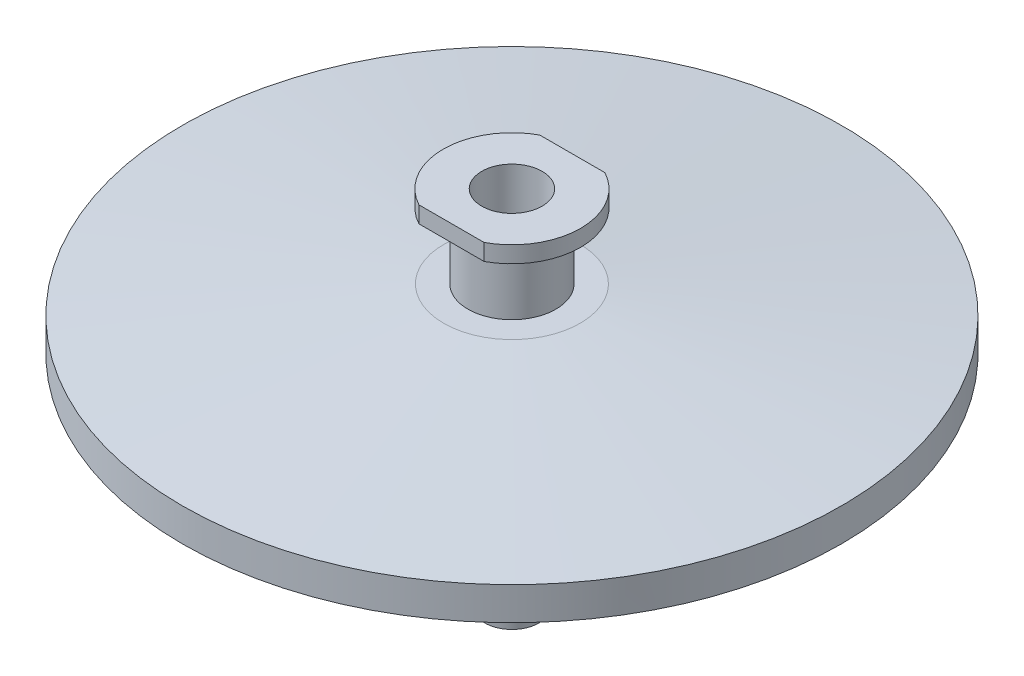
ISO-10303-21;
HEADER;
FILE_DESCRIPTION(('STEP AP214'),'2;1');
FILE_NAME('part.step','',(''),(''),'','','');
FILE_SCHEMA(('AUTOMOTIVE_DESIGN { 1 0 10303 214 1 1 1 1 }'));
ENDSEC;
DATA;
#1=APPLICATION_CONTEXT('core data for automotive mechanical design processes');
#2=APPLICATION_PROTOCOL_DEFINITION('international standard','automotive_design',2000,#1);
#3=PRODUCT_CONTEXT('',#1,'mechanical');
#4=PRODUCT('Part','Part','',(#3));
#5=PRODUCT_RELATED_PRODUCT_CATEGORY('part','',(#4));
#6=PRODUCT_DEFINITION_FORMATION('','',#4);
#7=PRODUCT_DEFINITION_CONTEXT('part definition',#1,'design');
#8=PRODUCT_DEFINITION('design','',#6,#7);
#9=PRODUCT_DEFINITION_SHAPE('','',#8);
#10=(LENGTH_UNIT() NAMED_UNIT(*) SI_UNIT(.MILLI.,.METRE.));
#11=(NAMED_UNIT(*) PLANE_ANGLE_UNIT() SI_UNIT($,.RADIAN.));
#12=(NAMED_UNIT(*) SI_UNIT($,.STERADIAN.) SOLID_ANGLE_UNIT());
#13=UNCERTAINTY_MEASURE_WITH_UNIT(LENGTH_MEASURE(1.E-05),#10,'distance_accuracy_value','');
#14=(GEOMETRIC_REPRESENTATION_CONTEXT(3) GLOBAL_UNCERTAINTY_ASSIGNED_CONTEXT((#13)) GLOBAL_UNIT_ASSIGNED_CONTEXT((#10,
#11,#12)) REPRESENTATION_CONTEXT('',''));
#15=CARTESIAN_POINT('',(0.,0.,0.));
#16=DIRECTION('',(0.,0.,1.));
#17=DIRECTION('',(1.,0.,0.));
#18=AXIS2_PLACEMENT_3D('',#15,#16,#17);
#19=CARTESIAN_POINT('',(0.,-0.127,0.));
#20=DIRECTION('',(0.,1.,0.));
#21=DIRECTION('',(0.,0.,1.));
#22=AXIS2_PLACEMENT_3D('',#19,#20,#21);
#23=CYLINDRICAL_SURFACE('',#22,13.97);
#24=CARTESIAN_POINT('',(0.,-0.127,0.));
#25=DIRECTION('',(0.,1.,0.));
#26=DIRECTION('',(0.,0.,1.));
#27=AXIS2_PLACEMENT_3D('',#24,#25,#26);
#28=CIRCLE('',#27,13.97);
#29=CARTESIAN_POINT('',(0.,-0.127,13.97));
#30=VERTEX_POINT('',#29);
#31=EDGE_CURVE('E11',#30,#30,#28,.T.);
#32=ORIENTED_EDGE('',*,*,#31,.T.);
#33=EDGE_LOOP('',(#32));
#34=FACE_BOUND('',#33,.T.);
#35=CARTESIAN_POINT('',(0.,0.127,0.));
#36=DIRECTION('',(0.,1.,0.));
#37=DIRECTION('',(0.,0.,1.));
#38=AXIS2_PLACEMENT_3D('',#35,#36,#37);
#39=CIRCLE('',#38,13.97);
#40=CARTESIAN_POINT('',(0.,0.127,13.97));
#41=VERTEX_POINT('',#40);
#42=EDGE_CURVE('E57',#41,#41,#39,.T.);
#43=ORIENTED_EDGE('',*,*,#42,.F.);
#44=EDGE_LOOP('',(#43));
#45=FACE_BOUND('',#44,.T.);
#46=ADVANCED_FACE('F51',(#34,#45),#23,.T.);
#47=CARTESIAN_POINT('',(0.,-0.127,0.));
#48=DIRECTION('',(0.,1.,0.));
#49=DIRECTION('',(0.,0.,1.));
#50=AXIS2_PLACEMENT_3D('',#47,#48,#49);
#51=PLANE('',#50);
#52=ORIENTED_EDGE('',*,*,#31,.F.);
#53=EDGE_LOOP('',(#52));
#54=FACE_BOUND('',#53,.T.);
#55=ADVANCED_FACE('F66',(#54),#51,.F.);
#56=CARTESIAN_POINT('',(0.,0.127,0.));
#57=DIRECTION('',(0.,1.,0.));
#58=DIRECTION('',(0.,0.,1.));
#59=AXIS2_PLACEMENT_3D('',#56,#57,#58);
#60=PLANE('',#59);
#61=ORIENTED_EDGE('',*,*,#42,.T.);
#62=EDGE_LOOP('',(#61));
#63=FACE_BOUND('',#62,.T.);
#64=ADVANCED_FACE('F63',(#63),#60,.T.);
#65=CLOSED_SHELL('',(#46,#55,#64));
#66=MANIFOLD_SOLID_BREP('B2',#65);
#67=CARTESIAN_POINT('',(0.,5.08,0.));
#68=DIRECTION('',(0.,1.,0.));
#69=DIRECTION('',(0.,0.,1.));
#70=AXIS2_PLACEMENT_3D('',#67,#68,#69);
#71=CYLINDRICAL_SURFACE('',#70,3.175);
#72=DIRECTION('',(0.,1.,0.));
#73=VECTOR('',#72,1.);
#74=CARTESIAN_POINT('',(-1.50804144505382,5.08,2.794));
#75=LINE('',#74,#73);
#76=CARTESIAN_POINT('',(-1.50804144505382,5.842,2.794));
#77=VERTEX_POINT('',#76);
#78=CARTESIAN_POINT('',(-1.50804144505382,5.08,2.794));
#79=VERTEX_POINT('',#78);
#80=EDGE_CURVE('E166',#77,#79,#75,.F.);
#81=ORIENTED_EDGE('',*,*,#80,.F.);
#82=CARTESIAN_POINT('',(0.,5.842,0.));
#83=DIRECTION('',(0.,1.,0.));
#84=DIRECTION('',(0.,0.,1.));
#85=AXIS2_PLACEMENT_3D('',#82,#83,#84);
#86=CIRCLE('',#85,3.175);
#87=CARTESIAN_POINT('',(-1.50804144505382,5.842,-2.794));
#88=VERTEX_POINT('',#87);
#89=EDGE_CURVE('E151',#88,#77,#86,.T.);
#90=ORIENTED_EDGE('',*,*,#89,.F.);
#91=DIRECTION('',(0.,1.,0.));
#92=VECTOR('',#91,1.);
#93=CARTESIAN_POINT('',(-1.50804144505382,5.08,-2.794));
#94=LINE('',#93,#92);
#95=CARTESIAN_POINT('',(-1.50804144505382,5.08,-2.794));
#96=VERTEX_POINT('',#95);
#97=EDGE_CURVE('E109',#96,#88,#94,.T.);
#98=ORIENTED_EDGE('',*,*,#97,.F.);
#99=CARTESIAN_POINT('',(0.,5.08,0.));
#100=DIRECTION('',(0.,1.,0.));
#101=DIRECTION('',(0.,0.,1.));
#102=AXIS2_PLACEMENT_3D('',#99,#100,#101);
#103=CIRCLE('',#102,3.175);
#104=EDGE_CURVE('E149',#96,#79,#103,.T.);
#105=ORIENTED_EDGE('',*,*,#104,.T.);
#106=EDGE_LOOP('',(#81,#90,#98,#105));
#107=FACE_BOUND('',#106,.T.);
#108=ADVANCED_FACE('F92',(#107),#71,.T.);
#109=CARTESIAN_POINT('',(0.,5.842,0.));
#110=DIRECTION('',(0.,-1.,0.));
#111=DIRECTION('',(0.,0.,-1.));
#112=AXIS2_PLACEMENT_3D('',#109,#110,#111);
#113=CYLINDRICAL_SURFACE('',#112,2.032);
#114=CARTESIAN_POINT('',(0.,2.032,0.));
#115=DIRECTION('',(0.,1.,0.));
#116=DIRECTION('',(0.,0.,1.));
#117=AXIS2_PLACEMENT_3D('',#114,#115,#116);
#118=CIRCLE('',#117,2.032);
#119=CARTESIAN_POINT('',(0.,2.032,-2.032));
#120=VERTEX_POINT('',#119);
#121=EDGE_CURVE('E173',#120,#120,#118,.T.);
#122=CARTESIAN_POINT('',(0.,5.08,0.));
#123=DIRECTION('',(0.,1.,0.));
#124=DIRECTION('',(0.,0.,1.));
#125=AXIS2_PLACEMENT_3D('',#122,#123,#124);
#126=CIRCLE('',#125,2.032);
#127=CARTESIAN_POINT('',(0.,5.08,-2.032));
#128=VERTEX_POINT('',#127);
#129=EDGE_CURVE('E197',#128,#128,#126,.T.);
#130=CARTESIAN_POINT('',(0.,2.032,-2.032));
#131=CARTESIAN_POINT('',(0.,2.06375,-2.032));
#132=CARTESIAN_POINT('',(0.,2.0955,-2.032));
#133=CARTESIAN_POINT('',(0.,2.159,-2.032));
#134=CARTESIAN_POINT('',(0.,2.19075,-2.032));
#135=CARTESIAN_POINT('',(0.,2.25425,-2.032));
#136=CARTESIAN_POINT('',(0.,2.286,-2.032));
#137=CARTESIAN_POINT('',(0.,2.3495,-2.032));
#138=CARTESIAN_POINT('',(0.,2.38125,-2.032));
#139=CARTESIAN_POINT('',(0.,2.44475,-2.032));
#140=CARTESIAN_POINT('',(0.,2.4765,-2.032));
#141=CARTESIAN_POINT('',(0.,2.54,-2.032));
#142=CARTESIAN_POINT('',(0.,2.57175,-2.032));
#143=CARTESIAN_POINT('',(0.,2.63525,-2.032));
#144=CARTESIAN_POINT('',(0.,2.667,-2.032));
#145=CARTESIAN_POINT('',(0.,2.7305,-2.032));
#146=CARTESIAN_POINT('',(0.,2.76225,-2.032));
#147=CARTESIAN_POINT('',(0.,2.82575,-2.032));
#148=CARTESIAN_POINT('',(0.,2.8575,-2.032));
#149=CARTESIAN_POINT('',(0.,2.921,-2.032));
#150=CARTESIAN_POINT('',(0.,2.95275,-2.032));
#151=CARTESIAN_POINT('',(0.,3.01625,-2.032));
#152=CARTESIAN_POINT('',(0.,3.048,-2.032));
#153=CARTESIAN_POINT('',(0.,3.1115,-2.032));
#154=CARTESIAN_POINT('',(0.,3.14325,-2.032));
#155=CARTESIAN_POINT('',(0.,3.20675,-2.032));
#156=CARTESIAN_POINT('',(0.,3.2385,-2.032));
#157=CARTESIAN_POINT('',(0.,3.302,-2.032));
#158=CARTESIAN_POINT('',(0.,3.33375,-2.032));
#159=CARTESIAN_POINT('',(0.,3.39725,-2.032));
#160=CARTESIAN_POINT('',(0.,3.429,-2.032));
#161=CARTESIAN_POINT('',(0.,3.4925,-2.032));
#162=CARTESIAN_POINT('',(0.,3.52425,-2.032));
#163=CARTESIAN_POINT('',(0.,3.58775,-2.032));
#164=CARTESIAN_POINT('',(0.,3.6195,-2.032));
#165=CARTESIAN_POINT('',(0.,3.683,-2.032));
#166=CARTESIAN_POINT('',(0.,3.71475,-2.032));
#167=CARTESIAN_POINT('',(0.,3.77825,-2.032));
#168=CARTESIAN_POINT('',(0.,3.81,-2.032));
#169=CARTESIAN_POINT('',(0.,3.8735,-2.032));
#170=CARTESIAN_POINT('',(0.,3.90525,-2.032));
#171=CARTESIAN_POINT('',(0.,3.96875,-2.032));
#172=CARTESIAN_POINT('',(0.,4.0005,-2.032));
#173=CARTESIAN_POINT('',(0.,4.064,-2.032));
#174=CARTESIAN_POINT('',(0.,4.09575,-2.032));
#175=CARTESIAN_POINT('',(0.,4.15925,-2.032));
#176=CARTESIAN_POINT('',(0.,4.191,-2.032));
#177=CARTESIAN_POINT('',(0.,4.2545,-2.032));
#178=CARTESIAN_POINT('',(0.,4.28625,-2.032));
#179=CARTESIAN_POINT('',(0.,4.34975,-2.032));
#180=CARTESIAN_POINT('',(0.,4.3815,-2.032));
#181=CARTESIAN_POINT('',(0.,4.445,-2.032));
#182=CARTESIAN_POINT('',(0.,4.47675,-2.032));
#183=CARTESIAN_POINT('',(0.,4.54025,-2.032));
#184=CARTESIAN_POINT('',(0.,4.572,-2.032));
#185=CARTESIAN_POINT('',(0.,4.6355,-2.032));
#186=CARTESIAN_POINT('',(0.,4.66725,-2.032));
#187=CARTESIAN_POINT('',(0.,4.73075,-2.032));
#188=CARTESIAN_POINT('',(0.,4.7625,-2.032));
#189=CARTESIAN_POINT('',(0.,4.826,-2.032));
#190=CARTESIAN_POINT('',(0.,4.85775,-2.032));
#191=CARTESIAN_POINT('',(0.,4.92125,-2.032));
#192=CARTESIAN_POINT('',(0.,4.953,-2.032));
#193=CARTESIAN_POINT('',(0.,5.0165,-2.032));
#194=CARTESIAN_POINT('',(0.,5.04825,-2.032));
#195=CARTESIAN_POINT('',(0.,5.08,-2.032));
#196=B_SPLINE_CURVE_WITH_KNOTS('',3,(#130,#131,#132,#133,#134,#135,#136,#137,#138,#139,#140,
#141,#142,#143,#144,#145,#146,#147,#148,#149,#150,#151,#152,#153,#154,#155,#156,#157,#158,#159,
#160,#161,#162,#163,#164,#165,#166,#167,#168,#169,#170,#171,#172,#173,#174,#175,#176,#177,#178,
#179,#180,#181,#182,#183,#184,#185,#186,#187,#188,#189,#190,#191,#192,#193,#194,#195),
.UNSPECIFIED.,.F.,.F.,(4,2,2,2,2,2,2,2,2,2,2,2,2,2,2,2,2,2,2,2,2,2,2,2,2,2,2,2,2,2,2,2,4),(0.,
0.0952499999999998,0.1905,0.28575,0.381,0.47625,0.5715,0.66675,0.762,0.85725,0.9525,1.04775,
1.143,1.23825,1.3335,1.42875,1.524,1.61925,1.7145,1.80975,1.905,2.00025,2.0955,2.19075,2.286,
2.38125,2.4765,2.57175,2.667,2.76225,2.8575,2.95275,3.048),.UNSPECIFIED.);
#197=EDGE_CURVE('BSEAM245',#120,#128,#196,.T.);
#198=ORIENTED_EDGE('',*,*,#121,.T.);
#199=ORIENTED_EDGE('',*,*,#129,.F.);
#200=ORIENTED_EDGE('',*,*,#197,.T.);
#201=ORIENTED_EDGE('',*,*,#197,.F.);
#202=EDGE_LOOP('',(#198,#200,#199,#201));
#203=FACE_BOUND('',#202,.T.);
#204=ADVANCED_FACE('F245',(#203),#113,.T.);
#205=CARTESIAN_POINT('',(0.,-0.762,0.));
#206=DIRECTION('',(0.,1.,0.));
#207=DIRECTION('',(0.,0.,1.));
#208=AXIS2_PLACEMENT_3D('',#205,#206,#207);
#209=CYLINDRICAL_SURFACE('',#208,15.24);
#210=CARTESIAN_POINT('',(0.,-0.762,0.));
#211=DIRECTION('',(0.,-1.,0.));
#212=DIRECTION('',(0.,0.,-1.));
#213=AXIS2_PLACEMENT_3D('',#210,#211,#212);
#214=CIRCLE('',#213,15.24);
#215=CARTESIAN_POINT('',(0.,-0.762,15.24));
#216=VERTEX_POINT('',#215);
#217=EDGE_CURVE('E177',#216,#216,#214,.T.);
#218=CARTESIAN_POINT('',(0.,0.762,0.));
#219=DIRECTION('',(0.,1.,0.));
#220=DIRECTION('',(0.,0.,1.));
#221=AXIS2_PLACEMENT_3D('',#218,#219,#220);
#222=CIRCLE('',#221,15.24);
#223=CARTESIAN_POINT('',(0.,0.762,15.24));
#224=VERTEX_POINT('',#223);
#225=EDGE_CURVE('E189',#224,#224,#222,.T.);
#226=CARTESIAN_POINT('',(0.,-0.762,15.24));
#227=CARTESIAN_POINT('',(0.,-0.746125,15.24));
#228=CARTESIAN_POINT('',(0.,-0.73025,15.24));
#229=CARTESIAN_POINT('',(0.,-0.6985,15.24));
#230=CARTESIAN_POINT('',(0.,-0.682625,15.24));
#231=CARTESIAN_POINT('',(0.,-0.650875,15.24));
#232=CARTESIAN_POINT('',(0.,-0.635,15.24));
#233=CARTESIAN_POINT('',(0.,-0.60325,15.24));
#234=CARTESIAN_POINT('',(0.,-0.587375,15.24));
#235=CARTESIAN_POINT('',(0.,-0.555625,15.24));
#236=CARTESIAN_POINT('',(0.,-0.53975,15.24));
#237=CARTESIAN_POINT('',(0.,-0.508,15.24));
#238=CARTESIAN_POINT('',(0.,-0.492125,15.24));
#239=CARTESIAN_POINT('',(0.,-0.460375,15.24));
#240=CARTESIAN_POINT('',(0.,-0.4445,15.24));
#241=CARTESIAN_POINT('',(0.,-0.41275,15.24));
#242=CARTESIAN_POINT('',(0.,-0.396875,15.24));
#243=CARTESIAN_POINT('',(0.,-0.365125,15.24));
#244=CARTESIAN_POINT('',(0.,-0.34925,15.24));
#245=CARTESIAN_POINT('',(0.,-0.3175,15.24));
#246=CARTESIAN_POINT('',(0.,-0.301625,15.24));
#247=CARTESIAN_POINT('',(0.,-0.269875,15.24));
#248=CARTESIAN_POINT('',(0.,-0.254,15.24));
#249=CARTESIAN_POINT('',(0.,-0.22225,15.24));
#250=CARTESIAN_POINT('',(0.,-0.206375,15.24));
#251=CARTESIAN_POINT('',(0.,-0.174625,15.24));
#252=CARTESIAN_POINT('',(0.,-0.15875,15.24));
#253=CARTESIAN_POINT('',(0.,-0.127,15.24));
#254=CARTESIAN_POINT('',(0.,-0.111125,15.24));
#255=CARTESIAN_POINT('',(0.,-0.0793750000000001,15.24));
#256=CARTESIAN_POINT('',(0.,-0.0635,15.24));
#257=CARTESIAN_POINT('',(0.,-0.03175,15.24));
#258=CARTESIAN_POINT('',(0.,-0.015875,15.24));
#259=CARTESIAN_POINT('',(0.,0.015875,15.24));
#260=CARTESIAN_POINT('',(0.,0.03175,15.24));
#261=CARTESIAN_POINT('',(0.,0.0635,15.24));
#262=CARTESIAN_POINT('',(0.,0.0793750000000001,15.24));
#263=CARTESIAN_POINT('',(0.,0.111125,15.24));
#264=CARTESIAN_POINT('',(0.,0.127,15.24));
#265=CARTESIAN_POINT('',(0.,0.15875,15.24));
#266=CARTESIAN_POINT('',(0.,0.174625,15.24));
#267=CARTESIAN_POINT('',(0.,0.206375,15.24));
#268=CARTESIAN_POINT('',(0.,0.22225,15.24));
#269=CARTESIAN_POINT('',(0.,0.254,15.24));
#270=CARTESIAN_POINT('',(0.,0.269875,15.24));
#271=CARTESIAN_POINT('',(0.,0.301625,15.24));
#272=CARTESIAN_POINT('',(0.,0.3175,15.24));
#273=CARTESIAN_POINT('',(0.,0.34925,15.24));
#274=CARTESIAN_POINT('',(0.,0.365125,15.24));
#275=CARTESIAN_POINT('',(0.,0.396875,15.24));
#276=CARTESIAN_POINT('',(0.,0.41275,15.24));
#277=CARTESIAN_POINT('',(0.,0.4445,15.24));
#278=CARTESIAN_POINT('',(0.,0.460375,15.24));
#279=CARTESIAN_POINT('',(0.,0.492125,15.24));
#280=CARTESIAN_POINT('',(0.,0.508,15.24));
#281=CARTESIAN_POINT('',(0.,0.53975,15.24));
#282=CARTESIAN_POINT('',(0.,0.555625,15.24));
#283=CARTESIAN_POINT('',(0.,0.587375,15.24));
#284=CARTESIAN_POINT('',(0.,0.60325,15.24));
#285=CARTESIAN_POINT('',(0.,0.635,15.24));
#286=CARTESIAN_POINT('',(0.,0.650875,15.24));
#287=CARTESIAN_POINT('',(0.,0.682625,15.24));
#288=CARTESIAN_POINT('',(0.,0.6985,15.24));
#289=CARTESIAN_POINT('',(0.,0.73025,15.24));
#290=CARTESIAN_POINT('',(0.,0.746125,15.24));
#291=CARTESIAN_POINT('',(0.,0.762,15.24));
#292=B_SPLINE_CURVE_WITH_KNOTS('',3,(#226,#227,#228,#229,#230,#231,#232,#233,#234,#235,#236,
#237,#238,#239,#240,#241,#242,#243,#244,#245,#246,#247,#248,#249,#250,#251,#252,#253,#254,#255,
#256,#257,#258,#259,#260,#261,#262,#263,#264,#265,#266,#267,#268,#269,#270,#271,#272,#273,#274,
#275,#276,#277,#278,#279,#280,#281,#282,#283,#284,#285,#286,#287,#288,#289,#290,#291),
.UNSPECIFIED.,.F.,.F.,(4,2,2,2,2,2,2,2,2,2,2,2,2,2,2,2,2,2,2,2,2,2,2,2,2,2,2,2,2,2,2,2,4),(0.,
0.047625,0.0952500000000001,0.142875,0.1905,0.238125,0.28575,0.333375,0.381,0.428625,0.47625,
0.523875,0.5715,0.619125,0.66675,0.714375,0.762,0.809625,0.85725,0.904875,0.9525,1.000125,
1.04775,1.095375,1.143,1.190625,1.23825,1.285875,1.3335,1.381125,1.42875,1.476375,1.524),.UNSPECIFIED.);
#293=EDGE_CURVE('BSEAM94',#216,#224,#292,.T.);
#294=ORIENTED_EDGE('',*,*,#217,.F.);
#295=ORIENTED_EDGE('',*,*,#225,.F.);
#296=ORIENTED_EDGE('',*,*,#293,.T.);
#297=ORIENTED_EDGE('',*,*,#293,.F.);
#298=EDGE_LOOP('',(#294,#296,#295,#297));
#299=FACE_BOUND('',#298,.T.);
#300=ADVANCED_FACE('F94',(#299),#209,.T.);
#301=CARTESIAN_POINT('',(0.,0.762,0.));
#302=DIRECTION('',(0.,-1.,0.));
#303=DIRECTION('',(0.,0.,1.));
#304=AXIS2_PLACEMENT_3D('',#301,#302,#303);
#305=CONICAL_SURFACE('',#304,15.24,1.46607657167524);
#306=CARTESIAN_POINT('',(0.,2.032,0.));
#307=DIRECTION('',(0.,1.,0.));
#308=DIRECTION('',(0.,0.,1.));
#309=AXIS2_PLACEMENT_3D('',#306,#307,#308);
#310=CIRCLE('',#309,3.15675714313695);
#311=CARTESIAN_POINT('',(0.,2.032,3.15675714313695));
#312=VERTEX_POINT('',#311);
#313=EDGE_CURVE('E185',#312,#312,#310,.T.);
#314=CARTESIAN_POINT('',(0.,2.032,3.15675714313695));
#315=CARTESIAN_POINT('',(0.,2.01877083333333,3.28262425622928));
#316=CARTESIAN_POINT('',(0.,2.00554166666667,3.4084913693216));
#317=CARTESIAN_POINT('',(0.,1.97908333333333,3.66022559550625));
#318=CARTESIAN_POINT('',(0.,1.96585416666667,3.78609270859857));
#319=CARTESIAN_POINT('',(0.,1.93939583333333,4.03782693478322));
#320=CARTESIAN_POINT('',(0.,1.92616666666667,4.16369404787554));
#321=CARTESIAN_POINT('',(0.,1.89970833333333,4.41542827406019));
#322=CARTESIAN_POINT('',(0.,1.88647916666667,4.54129538715251));
#323=CARTESIAN_POINT('',(0.,1.86002083333333,4.79302961333716));
#324=CARTESIAN_POINT('',(0.,1.84679166666667,4.91889672642948));
#325=CARTESIAN_POINT('',(0.,1.82033333333333,5.17063095261413));
#326=CARTESIAN_POINT('',(0.,1.80710416666667,5.29649806570645));
#327=CARTESIAN_POINT('',(0.,1.78064583333333,5.5482322918911));
#328=CARTESIAN_POINT('',(0.,1.76741666666667,5.67409940498342));
#329=CARTESIAN_POINT('',(0.,1.74095833333333,5.92583363116807));
#330=CARTESIAN_POINT('',(0.,1.72772916666667,6.05170074426039));
#331=CARTESIAN_POINT('',(0.,1.70127083333333,6.30343497044504));
#332=CARTESIAN_POINT('',(0.,1.68804166666667,6.42930208353736));
#333=CARTESIAN_POINT('',(0.,1.66158333333333,6.68103630972201));
#334=CARTESIAN_POINT('',(0.,1.64835416666667,6.80690342281433));
#335=CARTESIAN_POINT('',(0.,1.62189583333333,7.05863764899898));
#336=CARTESIAN_POINT('',(0.,1.60866666666667,7.1845047620913));
#337=CARTESIAN_POINT('',(0.,1.58220833333333,7.43623898827595));
#338=CARTESIAN_POINT('',(0.,1.56897916666667,7.56210610136827));
#339=CARTESIAN_POINT('',(0.,1.54252083333333,7.81384032755292));
#340=CARTESIAN_POINT('',(0.,1.52929166666667,7.93970744064524));
#341=CARTESIAN_POINT('',(0.,1.50283333333333,8.19144166682989));
#342=CARTESIAN_POINT('',(0.,1.48960416666667,8.31730877992221));
#343=CARTESIAN_POINT('',(0.,1.46314583333333,8.56904300610686));
#344=CARTESIAN_POINT('',(0.,1.44991666666667,8.69491011919918));
#345=CARTESIAN_POINT('',(0.,1.42345833333333,8.94664434538383));
#346=CARTESIAN_POINT('',(0.,1.41022916666667,9.07251145847615));
#347=CARTESIAN_POINT('',(0.,1.38377083333333,9.3242456846608));
#348=CARTESIAN_POINT('',(0.,1.37054166666667,9.45011279775312));
#349=CARTESIAN_POINT('',(0.,1.34408333333333,9.70184702393777));
#350=CARTESIAN_POINT('',(0.,1.33085416666667,9.82771413703009));
#351=CARTESIAN_POINT('',(0.,1.30439583333333,10.0794483632147));
#352=CARTESIAN_POINT('',(0.,1.29116666666667,10.2053154763071));
#353=CARTESIAN_POINT('',(0.,1.26470833333333,10.4570497024917));
#354=CARTESIAN_POINT('',(0.,1.25147916666667,10.582916815584));
#355=CARTESIAN_POINT('',(0.,1.22502083333333,10.8346510417687));
#356=CARTESIAN_POINT('',(0.,1.21179166666667,10.960518154861));
#357=CARTESIAN_POINT('',(0.,1.18533333333333,11.2122523810457));
#358=CARTESIAN_POINT('',(0.,1.17210416666667,11.338119494138));
#359=CARTESIAN_POINT('',(0.,1.14564583333333,11.5898537203226));
#360=CARTESIAN_POINT('',(0.,1.13241666666667,11.7157208334149));
#361=CARTESIAN_POINT('',(0.,1.10595833333333,11.9674550595996));
#362=CARTESIAN_POINT('',(0.,1.09272916666667,12.0933221726919));
#363=CARTESIAN_POINT('',(0.,1.06627083333333,12.3450563988766));
#364=CARTESIAN_POINT('',(0.,1.05304166666667,12.4709235119689));
#365=CARTESIAN_POINT('',(0.,1.02658333333333,12.7226577381535));
#366=CARTESIAN_POINT('',(0.,1.01335416666667,12.8485248512459));
#367=CARTESIAN_POINT('',(0.,0.986895833333334,13.1002590774305));
#368=CARTESIAN_POINT('',(0.,0.973666666666667,13.2261261905228));
#369=CARTESIAN_POINT('',(0.,0.947208333333333,13.4778604167075));
#370=CARTESIAN_POINT('',(0.,0.933979166666667,13.6037275297998));
#371=CARTESIAN_POINT('',(0.,0.907520833333333,13.8554617559844));
#372=CARTESIAN_POINT('',(0.,0.894291666666667,13.9813288690768));
#373=CARTESIAN_POINT('',(0.,0.867833333333333,14.2330630952614));
#374=CARTESIAN_POINT('',(0.,0.854604166666667,14.3589302083537));
#375=CARTESIAN_POINT('',(0.,0.828145833333333,14.6106644345384));
#376=CARTESIAN_POINT('',(0.,0.814916666666667,14.7365315476307));
#377=CARTESIAN_POINT('',(0.,0.788458333333333,14.9882657738154));
#378=CARTESIAN_POINT('',(0.,0.775229166666667,15.1141328869077));
#379=CARTESIAN_POINT('',(0.,0.762,15.24));
#380=B_SPLINE_CURVE_WITH_KNOTS('',3,(#314,#315,#316,#317,#318,#319,#320,#321,#322,#323,#324,
#325,#326,#327,#328,#329,#330,#331,#332,#333,#334,#335,#336,#337,#338,#339,#340,#341,#342,#343,
#344,#345,#346,#347,#348,#349,#350,#351,#352,#353,#354,#355,#356,#357,#358,#359,#360,#361,#362,
#363,#364,#365,#366,#367,#368,#369,#370,#371,#372,#373,#374,#375,#376,#377,#378,#379),
.UNSPECIFIED.,.F.,.F.,(4,2,2,2,2,2,2,2,2,2,2,2,2,2,2,2,2,2,2,2,2,2,2,2,2,2,2,2,2,2,2,2,4),(0.,
0.379681273017265,0.759362546034532,1.1390438190518,1.51872509206906,1.89840636508633,
2.2780876381036,2.65776891112086,3.03745018413813,3.41713145715539,3.79681273017266,
4.17649400318992,4.55617527620719,4.93585654922445,5.31553782224172,5.69521909525899,
6.07490036827625,6.45458164129352,6.83426291431078,7.21394418732805,7.59362546034531,
7.97330673336258,8.35298800637985,8.73266927939711,9.11235055241438,9.49203182543164,
9.87171309844891,10.2513943714662,10.6310756444834,11.0107569175007,11.390438190518,
11.7701194635352,12.1498007365525),.UNSPECIFIED.);
#381=EDGE_CURVE('BSEAM276',#312,#224,#380,.T.);
#382=ORIENTED_EDGE('',*,*,#313,.F.);
#383=ORIENTED_EDGE('',*,*,#225,.T.);
#384=ORIENTED_EDGE('',*,*,#381,.T.);
#385=ORIENTED_EDGE('',*,*,#381,.F.);
#386=EDGE_LOOP('',(#382,#384,#383,#385));
#387=FACE_BOUND('',#386,.T.);
#388=ADVANCED_FACE('F276',(#387),#305,.T.);
#389=CARTESIAN_POINT('',(0.,2.032,0.));
#390=DIRECTION('',(0.,1.,0.));
#391=DIRECTION('',(0.,0.,1.));
#392=AXIS2_PLACEMENT_3D('',#389,#390,#391);
#393=PLANE('',#392);
#394=ORIENTED_EDGE('',*,*,#121,.F.);
#395=EDGE_LOOP('',(#394));
#396=FACE_BOUND('',#395,.T.);
#397=ORIENTED_EDGE('',*,*,#313,.T.);
#398=EDGE_LOOP('',(#397));
#399=FACE_BOUND('',#398,.T.);
#400=ADVANCED_FACE('F268',(#396,#399),#393,.T.);
#401=CARTESIAN_POINT('',(0.,-0.762,0.));
#402=DIRECTION('',(0.,1.,0.));
#403=DIRECTION('',(0.,0.,-1.));
#404=AXIS2_PLACEMENT_3D('',#401,#402,#403);
#405=CONICAL_SURFACE('',#404,15.24,1.46607657167524);
#406=CARTESIAN_POINT('',(0.,-2.032,0.));
#407=DIRECTION('',(0.,-1.,0.));
#408=DIRECTION('',(0.,0.,-1.));
#409=AXIS2_PLACEMENT_3D('',#406,#407,#408);
#410=CIRCLE('',#409,3.15675714313695);
#411=CARTESIAN_POINT('',(0.,-2.032,-3.15675714313695));
#412=VERTEX_POINT('',#411);
#413=EDGE_CURVE('E181',#412,#412,#410,.T.);
#414=ORIENTED_EDGE('',*,*,#413,.F.);
#415=EDGE_LOOP('',(#414));
#416=FACE_BOUND('',#415,.T.);
#417=ORIENTED_EDGE('',*,*,#217,.T.);
#418=EDGE_LOOP('',(#417));
#419=FACE_BOUND('',#418,.T.);
#420=ADVANCED_FACE('F262',(#416,#419),#405,.T.);
#421=CARTESIAN_POINT('',(0.,-2.032,0.));
#422=DIRECTION('',(0.,-1.,0.));
#423=DIRECTION('',(0.,0.,-1.));
#424=AXIS2_PLACEMENT_3D('',#421,#422,#423);
#425=PLANE('',#424);
#426=CARTESIAN_POINT('',(0.,-2.032,0.));
#427=DIRECTION('',(0.,-1.,0.));
#428=DIRECTION('',(0.,0.,-1.));
#429=AXIS2_PLACEMENT_3D('',#426,#427,#428);
#430=CIRCLE('',#429,2.032);
#431=CARTESIAN_POINT('',(0.,-2.032,-2.032));
#432=VERTEX_POINT('',#431);
#433=EDGE_CURVE('E49',#432,#432,#430,.T.);
#434=ORIENTED_EDGE('',*,*,#433,.F.);
#435=EDGE_LOOP('',(#434));
#436=FACE_BOUND('',#435,.T.);
#437=ORIENTED_EDGE('',*,*,#413,.T.);
#438=EDGE_LOOP('',(#437));
#439=FACE_BOUND('',#438,.T.);
#440=ADVANCED_FACE('F255',(#436,#439),#425,.T.);
#441=DIRECTION('',(0.,1.,0.));
#442=VECTOR('',#441,1.);
#443=CARTESIAN_POINT('',(1.50804144505382,5.08,2.794));
#444=LINE('',#443,#442);
#445=CARTESIAN_POINT('',(1.50804144505381,5.08,2.794));
#446=VERTEX_POINT('',#445);
#447=CARTESIAN_POINT('',(1.50804144505381,5.842,2.794));
#448=VERTEX_POINT('',#447);
#449=EDGE_CURVE('E117',#446,#448,#444,.T.);
#450=ORIENTED_EDGE('',*,*,#449,.F.);
#451=CARTESIAN_POINT('',(1.50804144505381,5.08,-2.794));
#452=VERTEX_POINT('',#451);
#453=EDGE_CURVE('E157',#446,#452,#103,.T.);
#454=ORIENTED_EDGE('',*,*,#453,.T.);
#455=DIRECTION('',(0.,1.,0.));
#456=VECTOR('',#455,1.);
#457=CARTESIAN_POINT('',(1.50804144505382,5.08,-2.794));
#458=LINE('',#457,#456);
#459=CARTESIAN_POINT('',(1.50804144505381,5.842,-2.794));
#460=VERTEX_POINT('',#459);
#461=EDGE_CURVE('E136',#460,#452,#458,.F.);
#462=ORIENTED_EDGE('',*,*,#461,.F.);
#463=EDGE_CURVE('E158',#448,#460,#86,.T.);
#464=ORIENTED_EDGE('',*,*,#463,.F.);
#465=EDGE_LOOP('',(#450,#454,#462,#464));
#466=FACE_BOUND('',#465,.T.);
#467=ADVANCED_FACE('F210',(#466),#71,.T.);
#468=CARTESIAN_POINT('',(0.,5.08,0.));
#469=DIRECTION('',(0.,1.,0.));
#470=DIRECTION('',(0.,0.,1.));
#471=AXIS2_PLACEMENT_3D('',#468,#469,#470);
#472=PLANE('',#471);
#473=ORIENTED_EDGE('',*,*,#129,.T.);
#474=EDGE_LOOP('',(#473));
#475=FACE_BOUND('',#474,.T.);
#476=ORIENTED_EDGE('',*,*,#453,.F.);
#477=DIRECTION('',(1.,0.,0.));
#478=VECTOR('',#477,1.);
#479=CARTESIAN_POINT('',(-15.24,5.08,2.794));
#480=LINE('',#479,#478);
#481=EDGE_CURVE('E142',#79,#446,#480,.T.);
#482=ORIENTED_EDGE('',*,*,#481,.F.);
#483=ORIENTED_EDGE('',*,*,#104,.F.);
#484=DIRECTION('',(1.,0.,0.));
#485=VECTOR('',#484,1.);
#486=CARTESIAN_POINT('',(-15.24,5.08,-2.794));
#487=LINE('',#486,#485);
#488=EDGE_CURVE('E133',#96,#452,#487,.T.);
#489=ORIENTED_EDGE('',*,*,#488,.T.);
#490=EDGE_LOOP('',(#476,#482,#483,#489));
#491=FACE_BOUND('',#490,.T.);
#492=ADVANCED_FACE('F155',(#475,#491),#472,.F.);
#493=CARTESIAN_POINT('',(0.,2.032,0.));
#494=DIRECTION('',(0.,1.,0.));
#495=DIRECTION('',(0.,0.,1.));
#496=AXIS2_PLACEMENT_3D('',#493,#494,#495);
#497=CIRCLE('',#496,1.397);
#498=CARTESIAN_POINT('',(0.,2.032,-1.397));
#499=VERTEX_POINT('',#498);
#500=EDGE_CURVE('E193',#499,#499,#497,.F.);
#501=ORIENTED_EDGE('',*,*,#500,.F.);
#502=EDGE_LOOP('',(#501));
#503=FACE_BOUND('',#502,.T.);
#504=ADVANCED_FACE('F260',(#503),#393,.T.);
#505=CARTESIAN_POINT('',(0.,5.842,0.));
#506=DIRECTION('',(0.,-1.,0.));
#507=DIRECTION('',(0.,0.,-1.));
#508=AXIS2_PLACEMENT_3D('',#505,#506,#507);
#509=CYLINDRICAL_SURFACE('',#508,1.397);
#510=CARTESIAN_POINT('',(0.,5.842,0.));
#511=DIRECTION('',(0.,1.,0.));
#512=DIRECTION('',(0.,0.,1.));
#513=AXIS2_PLACEMENT_3D('',#510,#511,#512);
#514=CIRCLE('',#513,1.397);
#515=CARTESIAN_POINT('',(0.,5.842,-1.397));
#516=VERTEX_POINT('',#515);
#517=EDGE_CURVE('E162',#516,#516,#514,.T.);
#518=CARTESIAN_POINT('',(0.,5.842,-1.397));
#519=CARTESIAN_POINT('',(0.,5.8023125,-1.397));
#520=CARTESIAN_POINT('',(0.,5.762625,-1.397));
#521=CARTESIAN_POINT('',(0.,5.68325,-1.397));
#522=CARTESIAN_POINT('',(0.,5.6435625,-1.397));
#523=CARTESIAN_POINT('',(0.,5.5641875,-1.397));
#524=CARTESIAN_POINT('',(0.,5.5245,-1.397));
#525=CARTESIAN_POINT('',(0.,5.445125,-1.397));
#526=CARTESIAN_POINT('',(0.,5.4054375,-1.397));
#527=CARTESIAN_POINT('',(0.,5.3260625,-1.397));
#528=CARTESIAN_POINT('',(0.,5.286375,-1.397));
#529=CARTESIAN_POINT('',(0.,5.207,-1.397));
#530=CARTESIAN_POINT('',(0.,5.1673125,-1.397));
#531=CARTESIAN_POINT('',(0.,5.0879375,-1.397));
#532=CARTESIAN_POINT('',(0.,5.04825,-1.397));
#533=CARTESIAN_POINT('',(0.,4.968875,-1.397));
#534=CARTESIAN_POINT('',(0.,4.9291875,-1.397));
#535=CARTESIAN_POINT('',(0.,4.8498125,-1.397));
#536=CARTESIAN_POINT('',(0.,4.810125,-1.397));
#537=CARTESIAN_POINT('',(0.,4.73075,-1.397));
#538=CARTESIAN_POINT('',(0.,4.6910625,-1.397));
#539=CARTESIAN_POINT('',(0.,4.6116875,-1.397));
#540=CARTESIAN_POINT('',(0.,4.572,-1.397));
#541=CARTESIAN_POINT('',(0.,4.492625,-1.397));
#542=CARTESIAN_POINT('',(0.,4.4529375,-1.397));
#543=CARTESIAN_POINT('',(0.,4.3735625,-1.397));
#544=CARTESIAN_POINT('',(0.,4.333875,-1.397));
#545=CARTESIAN_POINT('',(0.,4.2545,-1.397));
#546=CARTESIAN_POINT('',(0.,4.2148125,-1.397));
#547=CARTESIAN_POINT('',(0.,4.1354375,-1.397));
#548=CARTESIAN_POINT('',(0.,4.09575,-1.397));
#549=CARTESIAN_POINT('',(0.,4.016375,-1.397));
#550=CARTESIAN_POINT('',(0.,3.9766875,-1.397));
#551=CARTESIAN_POINT('',(0.,3.8973125,-1.397));
#552=CARTESIAN_POINT('',(0.,3.857625,-1.397));
#553=CARTESIAN_POINT('',(0.,3.77825,-1.397));
#554=CARTESIAN_POINT('',(0.,3.7385625,-1.397));
#555=CARTESIAN_POINT('',(0.,3.6591875,-1.397));
#556=CARTESIAN_POINT('',(0.,3.6195,-1.397));
#557=CARTESIAN_POINT('',(0.,3.540125,-1.397));
#558=CARTESIAN_POINT('',(0.,3.5004375,-1.397));
#559=CARTESIAN_POINT('',(0.,3.4210625,-1.397));
#560=CARTESIAN_POINT('',(0.,3.381375,-1.397));
#561=CARTESIAN_POINT('',(0.,3.302,-1.397));
#562=CARTESIAN_POINT('',(0.,3.2623125,-1.397));
#563=CARTESIAN_POINT('',(0.,3.1829375,-1.397));
#564=CARTESIAN_POINT('',(0.,3.14325,-1.397));
#565=CARTESIAN_POINT('',(0.,3.063875,-1.397));
#566=CARTESIAN_POINT('',(0.,3.0241875,-1.397));
#567=CARTESIAN_POINT('',(0.,2.9448125,-1.397));
#568=CARTESIAN_POINT('',(0.,2.905125,-1.397));
#569=CARTESIAN_POINT('',(0.,2.82575,-1.397));
#570=CARTESIAN_POINT('',(0.,2.7860625,-1.397));
#571=CARTESIAN_POINT('',(0.,2.7066875,-1.397));
#572=CARTESIAN_POINT('',(0.,2.667,-1.397));
#573=CARTESIAN_POINT('',(0.,2.587625,-1.397));
#574=CARTESIAN_POINT('',(0.,2.5479375,-1.397));
#575=CARTESIAN_POINT('',(0.,2.4685625,-1.397));
#576=CARTESIAN_POINT('',(0.,2.428875,-1.397));
#577=CARTESIAN_POINT('',(0.,2.3495,-1.397));
#578=CARTESIAN_POINT('',(0.,2.3098125,-1.397));
#579=CARTESIAN_POINT('',(0.,2.2304375,-1.397));
#580=CARTESIAN_POINT('',(0.,2.19075,-1.397));
#581=CARTESIAN_POINT('',(0.,2.111375,-1.397));
#582=CARTESIAN_POINT('',(0.,2.0716875,-1.397));
#583=CARTESIAN_POINT('',(0.,2.032,-1.397));
#584=B_SPLINE_CURVE_WITH_KNOTS('',3,(#518,#519,#520,#521,#522,#523,#524,#525,#526,#527,#528,
#529,#530,#531,#532,#533,#534,#535,#536,#537,#538,#539,#540,#541,#542,#543,#544,#545,#546,#547,
#548,#549,#550,#551,#552,#553,#554,#555,#556,#557,#558,#559,#560,#561,#562,#563,#564,#565,#566,
#567,#568,#569,#570,#571,#572,#573,#574,#575,#576,#577,#578,#579,#580,#581,#582,#583),
.UNSPECIFIED.,.F.,.F.,(4,2,2,2,2,2,2,2,2,2,2,2,2,2,2,2,2,2,2,2,2,2,2,2,2,2,2,2,2,2,2,2,4),(0.,
0.1190625,0.238125,0.357187500000001,0.47625,0.5953125,0.714375000000001,0.833437500000001,
0.9525,1.0715625,1.190625,1.3096875,1.42875,1.5478125,1.666875,1.7859375,1.905,2.0240625,
2.143125,2.2621875,2.38125,2.5003125,2.619375,2.7384375,2.8575,2.9765625,3.095625,3.2146875,
3.33375,3.4528125,3.571875,3.6909375,3.81),.UNSPECIFIED.);
#585=EDGE_CURVE('BSEAM327',#516,#499,#584,.T.);
#586=ORIENTED_EDGE('',*,*,#517,.T.);
#587=ORIENTED_EDGE('',*,*,#500,.T.);
#588=ORIENTED_EDGE('',*,*,#585,.T.);
#589=ORIENTED_EDGE('',*,*,#585,.F.);
#590=EDGE_LOOP('',(#586,#588,#587,#589));
#591=FACE_BOUND('',#590,.T.);
#592=ADVANCED_FACE('F327',(#591),#509,.F.);
#593=CARTESIAN_POINT('',(0.,5.842,0.));
#594=DIRECTION('',(0.,1.,0.));
#595=DIRECTION('',(0.,0.,1.));
#596=AXIS2_PLACEMENT_3D('',#593,#594,#595);
#597=PLANE('',#596);
#598=DIRECTION('',(-1.,0.,0.));
#599=VECTOR('',#598,1.);
#600=CARTESIAN_POINT('',(0.,5.842,2.794));
#601=LINE('',#600,#599);
#602=EDGE_CURVE('E96',#448,#77,#601,.T.);
#603=ORIENTED_EDGE('',*,*,#602,.F.);
#604=ORIENTED_EDGE('',*,*,#463,.T.);
#605=DIRECTION('',(1.,0.,0.));
#606=VECTOR('',#605,1.);
#607=CARTESIAN_POINT('',(0.,5.842,-2.794));
#608=LINE('',#607,#606);
#609=EDGE_CURVE('E200',#88,#460,#608,.T.);
#610=ORIENTED_EDGE('',*,*,#609,.F.);
#611=ORIENTED_EDGE('',*,*,#89,.T.);
#612=EDGE_LOOP('',(#603,#604,#610,#611));
#613=FACE_BOUND('',#612,.T.);
#614=ORIENTED_EDGE('',*,*,#517,.F.);
#615=EDGE_LOOP('',(#614));
#616=FACE_BOUND('',#615,.T.);
#617=ADVANCED_FACE('F207',(#613,#616),#597,.T.);
#618=CARTESIAN_POINT('',(-15.24,5.08,-2.794));
#619=DIRECTION('',(0.,0.,1.));
#620=DIRECTION('',(1.,0.,0.));
#621=AXIS2_PLACEMENT_3D('',#618,#619,#620);
#622=PLANE('',#621);
#623=ORIENTED_EDGE('',*,*,#461,.T.);
#624=ORIENTED_EDGE('',*,*,#488,.F.);
#625=ORIENTED_EDGE('',*,*,#97,.T.);
#626=ORIENTED_EDGE('',*,*,#609,.T.);
#627=EDGE_LOOP('',(#623,#624,#625,#626));
#628=FACE_BOUND('',#627,.T.);
#629=ADVANCED_FACE('F134',(#628),#622,.F.);
#630=CARTESIAN_POINT('',(-15.24,5.08,2.794));
#631=DIRECTION('',(0.,0.,-1.));
#632=DIRECTION('',(0.,1.,0.));
#633=AXIS2_PLACEMENT_3D('',#630,#631,#632);
#634=PLANE('',#633);
#635=ORIENTED_EDGE('',*,*,#80,.T.);
#636=ORIENTED_EDGE('',*,*,#481,.T.);
#637=ORIENTED_EDGE('',*,*,#449,.T.);
#638=ORIENTED_EDGE('',*,*,#602,.T.);
#639=EDGE_LOOP('',(#635,#636,#637,#638));
#640=FACE_BOUND('',#639,.T.);
#641=ADVANCED_FACE('F203',(#640),#634,.F.);
#642=CARTESIAN_POINT('',(0.,-2.032,0.));
#643=DIRECTION('',(0.,1.,0.));
#644=DIRECTION('',(0.,0.,-1.));
#645=AXIS2_PLACEMENT_3D('',#642,#643,#644);
#646=CONICAL_SURFACE('',#645,2.032,0.0872664625997167);
#647=CARTESIAN_POINT('',(0.,-10.922,0.));
#648=DIRECTION('',(0.,-1.,0.));
#649=DIRECTION('',(0.,0.,-1.));
#650=AXIS2_PLACEMENT_3D('',#647,#648,#649);
#651=CIRCLE('',#650,1.25422578125453);
#652=CARTESIAN_POINT('',(0.,-10.922,-1.25422578125453));
#653=VERTEX_POINT('',#652);
#654=EDGE_CURVE('E143',#653,#653,#651,.T.);
#655=ORIENTED_EDGE('',*,*,#654,.F.);
#656=EDGE_LOOP('',(#655));
#657=FACE_BOUND('',#656,.T.);
#658=ORIENTED_EDGE('',*,*,#433,.T.);
#659=EDGE_LOOP('',(#658));
#660=FACE_BOUND('',#659,.T.);
#661=ADVANCED_FACE('F241',(#657,#660),#646,.T.);
#662=CARTESIAN_POINT('',(0.,-10.922,0.));
#663=DIRECTION('',(0.,-1.,0.));
#664=DIRECTION('',(0.,0.,-1.));
#665=AXIS2_PLACEMENT_3D('',#662,#663,#664);
#666=PLANE('',#665);
#667=CARTESIAN_POINT('',(0.,-10.922,0.));
#668=DIRECTION('',(0.,-1.,0.));
#669=DIRECTION('',(0.,0.,-1.));
#670=AXIS2_PLACEMENT_3D('',#667,#668,#669);
#671=CIRCLE('',#670,0.619225781254533);
#672=CARTESIAN_POINT('',(0.,-10.922,-0.619225781254533));
#673=VERTEX_POINT('',#672);
#674=EDGE_CURVE('E219',#673,#673,#671,.T.);
#675=ORIENTED_EDGE('',*,*,#674,.F.);
#676=EDGE_LOOP('',(#675));
#677=FACE_BOUND('',#676,.T.);
#678=ORIENTED_EDGE('',*,*,#654,.T.);
#679=EDGE_LOOP('',(#678));
#680=FACE_BOUND('',#679,.T.);
#681=ADVANCED_FACE('F233',(#677,#680),#666,.T.);
#682=CARTESIAN_POINT('',(0.,-2.032,0.));
#683=DIRECTION('',(0.,1.,0.));
#684=DIRECTION('',(0.,0.,-1.));
#685=AXIS2_PLACEMENT_3D('',#682,#683,#684);
#686=CONICAL_SURFACE('',#685,1.397,0.0872664625997167);
#687=ORIENTED_EDGE('',*,*,#674,.T.);
#688=EDGE_LOOP('',(#687));
#689=FACE_BOUND('',#688,.T.);
#690=CARTESIAN_POINT('',(0.,-2.032,0.));
#691=DIRECTION('',(0.,-1.,0.));
#692=DIRECTION('',(0.,0.,-1.));
#693=AXIS2_PLACEMENT_3D('',#690,#691,#692);
#694=CIRCLE('',#693,1.397);
#695=CARTESIAN_POINT('',(0.,-2.032,-1.397));
#696=VERTEX_POINT('',#695);
#697=EDGE_CURVE('E224',#696,#696,#694,.T.);
#698=ORIENTED_EDGE('',*,*,#697,.F.);
#699=EDGE_LOOP('',(#698));
#700=FACE_BOUND('',#699,.T.);
#701=ADVANCED_FACE('F231',(#689,#700),#686,.F.);
#702=CARTESIAN_POINT('',(0.,-2.032,0.));
#703=DIRECTION('',(0.,-1.,0.));
#704=DIRECTION('',(0.,0.,-1.));
#705=AXIS2_PLACEMENT_3D('',#702,#703,#704);
#706=PLANE('',#705);
#707=ORIENTED_EDGE('',*,*,#697,.T.);
#708=EDGE_LOOP('',(#707));
#709=FACE_BOUND('',#708,.T.);
#710=ADVANCED_FACE('F229',(#709),#706,.T.);
#711=CLOSED_SHELL('',(#108,#204,#300,#388,#400,#420,#440,#467,#492,#504,#592,#617,#629,#641,
#661,#681,#701,#710));
#712=MANIFOLD_SOLID_BREP('B6',#711);
#713=ADVANCED_BREP_SHAPE_REPRESENTATION('',(#18,#66,#712),#14);
#714=SHAPE_DEFINITION_REPRESENTATION(#9,#713);
ENDSEC;
END-ISO-10303-21;
